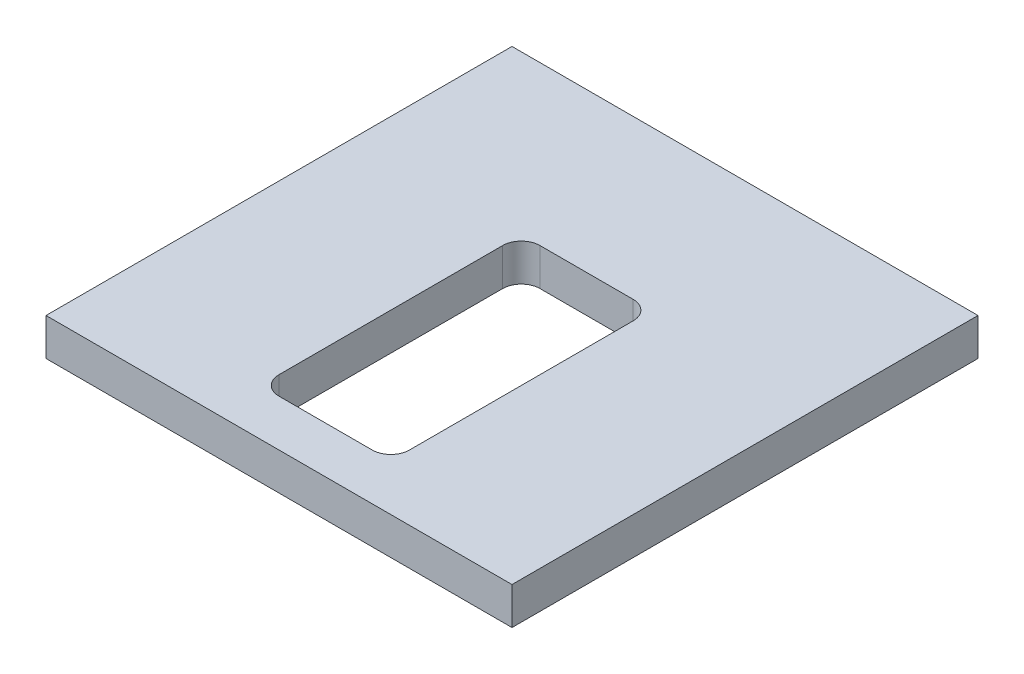
ISO-10303-21;
HEADER;
FILE_DESCRIPTION(('STEP AP214'),'2;1');
FILE_NAME('part.step','',(''),(''),'','','');
FILE_SCHEMA(('AUTOMOTIVE_DESIGN { 1 0 10303 214 1 1 1 1 }'));
ENDSEC;
DATA;
#1=APPLICATION_CONTEXT('core data for automotive mechanical design processes');
#2=APPLICATION_PROTOCOL_DEFINITION('international standard','automotive_design',2000,#1);
#3=PRODUCT_CONTEXT('',#1,'mechanical');
#4=PRODUCT('Part','Part','',(#3));
#5=PRODUCT_RELATED_PRODUCT_CATEGORY('part','',(#4));
#6=PRODUCT_DEFINITION_FORMATION('','',#4);
#7=PRODUCT_DEFINITION_CONTEXT('part definition',#1,'design');
#8=PRODUCT_DEFINITION('design','',#6,#7);
#9=PRODUCT_DEFINITION_SHAPE('','',#8);
#10=(LENGTH_UNIT() NAMED_UNIT(*) SI_UNIT(.MILLI.,.METRE.));
#11=(NAMED_UNIT(*) PLANE_ANGLE_UNIT() SI_UNIT($,.RADIAN.));
#12=(NAMED_UNIT(*) SI_UNIT($,.STERADIAN.) SOLID_ANGLE_UNIT());
#13=UNCERTAINTY_MEASURE_WITH_UNIT(LENGTH_MEASURE(1.E-05),#10,'distance_accuracy_value','');
#14=(GEOMETRIC_REPRESENTATION_CONTEXT(3) GLOBAL_UNCERTAINTY_ASSIGNED_CONTEXT((#13)) GLOBAL_UNIT_ASSIGNED_CONTEXT((#10,
#11,#12)) REPRESENTATION_CONTEXT('',''));
#15=CARTESIAN_POINT('',(0.,0.,0.));
#16=DIRECTION('',(0.,0.,1.));
#17=DIRECTION('',(1.,0.,0.));
#18=AXIS2_PLACEMENT_3D('',#15,#16,#17);
#19=CARTESIAN_POINT('',(12.5,1.,12.5));
#20=DIRECTION('',(-1.,0.,0.));
#21=DIRECTION('',(0.,0.,1.));
#22=AXIS2_PLACEMENT_3D('',#19,#20,#21);
#23=PLANE('',#22);
#24=DIRECTION('',(0.,0.,-1.));
#25=VECTOR('',#24,1.);
#26=CARTESIAN_POINT('',(12.5,-1.,12.5));
#27=LINE('',#26,#25);
#28=CARTESIAN_POINT('',(12.5,-1.,12.5));
#29=VERTEX_POINT('',#28);
#30=CARTESIAN_POINT('',(12.5,-1.,-12.5));
#31=VERTEX_POINT('',#30);
#32=EDGE_CURVE('E145',#29,#31,#27,.T.);
#33=ORIENTED_EDGE('',*,*,#32,.T.);
#34=DIRECTION('',(0.,-1.,0.));
#35=VECTOR('',#34,1.);
#36=CARTESIAN_POINT('',(12.5,1.,-12.5));
#37=LINE('',#36,#35);
#38=CARTESIAN_POINT('',(12.5,1.,-12.5));
#39=VERTEX_POINT('',#38);
#40=EDGE_CURVE('E126',#39,#31,#37,.T.);
#41=ORIENTED_EDGE('',*,*,#40,.F.);
#42=DIRECTION('',(0.,0.,-1.));
#43=VECTOR('',#42,1.);
#44=CARTESIAN_POINT('',(12.5,1.,12.5));
#45=LINE('',#44,#43);
#46=CARTESIAN_POINT('',(12.5,1.,12.5));
#47=VERTEX_POINT('',#46);
#48=EDGE_CURVE('E133',#47,#39,#45,.T.);
#49=ORIENTED_EDGE('',*,*,#48,.F.);
#50=DIRECTION('',(0.,-1.,0.));
#51=VECTOR('',#50,1.);
#52=CARTESIAN_POINT('',(12.5,1.,12.5));
#53=LINE('',#52,#51);
#54=EDGE_CURVE('E220',#47,#29,#53,.T.);
#55=ORIENTED_EDGE('',*,*,#54,.T.);
#56=EDGE_LOOP('',(#33,#41,#49,#55));
#57=FACE_BOUND('',#56,.T.);
#58=ADVANCED_FACE('F32',(#57),#23,.F.);
#59=CARTESIAN_POINT('',(-12.5,1.,-12.5));
#60=DIRECTION('',(0.,0.,1.));
#61=DIRECTION('',(1.,0.,0.));
#62=AXIS2_PLACEMENT_3D('',#59,#60,#61);
#63=PLANE('',#62);
#64=DIRECTION('',(-1.,0.,0.));
#65=VECTOR('',#64,1.);
#66=CARTESIAN_POINT('',(-12.5,-1.,-12.5));
#67=LINE('',#66,#65);
#68=CARTESIAN_POINT('',(-12.5,-1.,-12.5));
#69=VERTEX_POINT('',#68);
#70=EDGE_CURVE('E222',#31,#69,#67,.T.);
#71=ORIENTED_EDGE('',*,*,#70,.T.);
#72=DIRECTION('',(0.,-1.,0.));
#73=VECTOR('',#72,1.);
#74=CARTESIAN_POINT('',(-12.5,1.,-12.5));
#75=LINE('',#74,#73);
#76=CARTESIAN_POINT('',(-12.5,1.,-12.5));
#77=VERTEX_POINT('',#76);
#78=EDGE_CURVE('E129',#77,#69,#75,.T.);
#79=ORIENTED_EDGE('',*,*,#78,.F.);
#80=DIRECTION('',(-1.,0.,0.));
#81=VECTOR('',#80,1.);
#82=CARTESIAN_POINT('',(-12.5,1.,-12.5));
#83=LINE('',#82,#81);
#84=EDGE_CURVE('E122',#39,#77,#83,.T.);
#85=ORIENTED_EDGE('',*,*,#84,.F.);
#86=ORIENTED_EDGE('',*,*,#40,.T.);
#87=EDGE_LOOP('',(#71,#79,#85,#86));
#88=FACE_BOUND('',#87,.T.);
#89=ADVANCED_FACE('F124',(#88),#63,.F.);
#90=CARTESIAN_POINT('',(-12.5,1.,12.5));
#91=DIRECTION('',(1.,0.,0.));
#92=DIRECTION('',(0.,0.,-1.));
#93=AXIS2_PLACEMENT_3D('',#90,#91,#92);
#94=PLANE('',#93);
#95=DIRECTION('',(0.,0.,1.));
#96=VECTOR('',#95,1.);
#97=CARTESIAN_POINT('',(-12.5,-1.,12.5));
#98=LINE('',#97,#96);
#99=CARTESIAN_POINT('',(-12.5,-1.,12.5));
#100=VERTEX_POINT('',#99);
#101=EDGE_CURVE('E224',#69,#100,#98,.T.);
#102=ORIENTED_EDGE('',*,*,#101,.T.);
#103=DIRECTION('',(0.,-1.,0.));
#104=VECTOR('',#103,1.);
#105=CARTESIAN_POINT('',(-12.5,1.,12.5));
#106=LINE('',#105,#104);
#107=CARTESIAN_POINT('',(-12.5,1.,12.5));
#108=VERTEX_POINT('',#107);
#109=EDGE_CURVE('E150',#108,#100,#106,.T.);
#110=ORIENTED_EDGE('',*,*,#109,.F.);
#111=DIRECTION('',(0.,0.,1.));
#112=VECTOR('',#111,1.);
#113=CARTESIAN_POINT('',(-12.5,1.,12.5));
#114=LINE('',#113,#112);
#115=EDGE_CURVE('E132',#77,#108,#114,.T.);
#116=ORIENTED_EDGE('',*,*,#115,.F.);
#117=ORIENTED_EDGE('',*,*,#78,.T.);
#118=EDGE_LOOP('',(#102,#110,#116,#117));
#119=FACE_BOUND('',#118,.T.);
#120=ADVANCED_FACE('F234',(#119),#94,.F.);
#121=CARTESIAN_POINT('',(-12.5,1.,12.5));
#122=DIRECTION('',(0.,0.,-1.));
#123=DIRECTION('',(-1.,0.,0.));
#124=AXIS2_PLACEMENT_3D('',#121,#122,#123);
#125=PLANE('',#124);
#126=DIRECTION('',(1.,0.,0.));
#127=VECTOR('',#126,1.);
#128=CARTESIAN_POINT('',(-12.5,-1.,12.5));
#129=LINE('',#128,#127);
#130=EDGE_CURVE('E142',#100,#29,#129,.T.);
#131=ORIENTED_EDGE('',*,*,#130,.T.);
#132=ORIENTED_EDGE('',*,*,#54,.F.);
#133=DIRECTION('',(1.,0.,0.));
#134=VECTOR('',#133,1.);
#135=CARTESIAN_POINT('',(-12.5,1.,12.5));
#136=LINE('',#135,#134);
#137=EDGE_CURVE('E138',#108,#47,#136,.T.);
#138=ORIENTED_EDGE('',*,*,#137,.F.);
#139=ORIENTED_EDGE('',*,*,#109,.T.);
#140=EDGE_LOOP('',(#131,#132,#138,#139));
#141=FACE_BOUND('',#140,.T.);
#142=ADVANCED_FACE('F231',(#141),#125,.F.);
#143=CARTESIAN_POINT('',(0.,1.,0.));
#144=DIRECTION('',(0.,-1.,0.));
#145=DIRECTION('',(0.,0.,-1.));
#146=AXIS2_PLACEMENT_3D('',#143,#144,#145);
#147=PLANE('',#146);
#148=DIRECTION('',(1.,0.,0.));
#149=VECTOR('',#148,1.);
#150=CARTESIAN_POINT('',(-3.5,1.,10.));
#151=LINE('',#150,#149);
#152=CARTESIAN_POINT('',(-2.5,1.,10.));
#153=VERTEX_POINT('',#152);
#154=CARTESIAN_POINT('',(2.5,1.,10.));
#155=VERTEX_POINT('',#154);
#156=EDGE_CURVE('E206',#153,#155,#151,.T.);
#157=ORIENTED_EDGE('',*,*,#156,.F.);
#158=CARTESIAN_POINT('',(-2.5,1.,9.));
#159=DIRECTION('',(0.,-1.,0.));
#160=DIRECTION('',(0.,0.,-1.));
#161=AXIS2_PLACEMENT_3D('',#158,#159,#160);
#162=CIRCLE('',#161,1.);
#163=CARTESIAN_POINT('',(-3.5,1.,9.));
#164=VERTEX_POINT('',#163);
#165=EDGE_CURVE('E174',#153,#164,#162,.T.);
#166=ORIENTED_EDGE('',*,*,#165,.T.);
#167=DIRECTION('',(0.,0.,1.));
#168=VECTOR('',#167,1.);
#169=CARTESIAN_POINT('',(-3.5,1.,-4.));
#170=LINE('',#169,#168);
#171=CARTESIAN_POINT('',(-3.5,1.,-3.));
#172=VERTEX_POINT('',#171);
#173=EDGE_CURVE('E186',#172,#164,#170,.T.);
#174=ORIENTED_EDGE('',*,*,#173,.F.);
#175=CARTESIAN_POINT('',(-2.5,1.,-3.));
#176=DIRECTION('',(0.,-1.,0.));
#177=DIRECTION('',(0.,0.,-1.));
#178=AXIS2_PLACEMENT_3D('',#175,#176,#177);
#179=CIRCLE('',#178,1.);
#180=CARTESIAN_POINT('',(-2.5,1.,-4.));
#181=VERTEX_POINT('',#180);
#182=EDGE_CURVE('E40',#172,#181,#179,.T.);
#183=ORIENTED_EDGE('',*,*,#182,.T.);
#184=DIRECTION('',(-1.,0.,0.));
#185=VECTOR('',#184,1.);
#186=CARTESIAN_POINT('',(-3.5,1.,-4.));
#187=LINE('',#186,#185);
#188=CARTESIAN_POINT('',(2.5,1.,-4.));
#189=VERTEX_POINT('',#188);
#190=EDGE_CURVE('E184',#189,#181,#187,.T.);
#191=ORIENTED_EDGE('',*,*,#190,.F.);
#192=CARTESIAN_POINT('',(2.5,1.,-3.));
#193=DIRECTION('',(0.,-1.,0.));
#194=DIRECTION('',(0.,0.,-1.));
#195=AXIS2_PLACEMENT_3D('',#192,#193,#194);
#196=CIRCLE('',#195,1.);
#197=CARTESIAN_POINT('',(3.5,1.,-3.));
#198=VERTEX_POINT('',#197);
#199=EDGE_CURVE('E178',#189,#198,#196,.T.);
#200=ORIENTED_EDGE('',*,*,#199,.T.);
#201=DIRECTION('',(0.,0.,-1.));
#202=VECTOR('',#201,1.);
#203=CARTESIAN_POINT('',(3.5,1.,-4.));
#204=LINE('',#203,#202);
#205=CARTESIAN_POINT('',(3.5,1.,9.));
#206=VERTEX_POINT('',#205);
#207=EDGE_CURVE('E192',#206,#198,#204,.T.);
#208=ORIENTED_EDGE('',*,*,#207,.F.);
#209=CARTESIAN_POINT('',(2.5,1.,9.));
#210=DIRECTION('',(0.,-1.,0.));
#211=DIRECTION('',(0.,0.,-1.));
#212=AXIS2_PLACEMENT_3D('',#209,#210,#211);
#213=CIRCLE('',#212,1.);
#214=EDGE_CURVE('E170',#206,#155,#213,.T.);
#215=ORIENTED_EDGE('',*,*,#214,.T.);
#216=EDGE_LOOP('',(#157,#166,#174,#183,#191,#200,#208,#215));
#217=FACE_BOUND('',#216,.T.);
#218=ORIENTED_EDGE('',*,*,#48,.T.);
#219=ORIENTED_EDGE('',*,*,#84,.T.);
#220=ORIENTED_EDGE('',*,*,#115,.T.);
#221=ORIENTED_EDGE('',*,*,#137,.T.);
#222=EDGE_LOOP('',(#218,#219,#220,#221));
#223=FACE_BOUND('',#222,.T.);
#224=ADVANCED_FACE('F136',(#217,#223),#147,.F.);
#225=CARTESIAN_POINT('',(0.,-1.,0.));
#226=DIRECTION('',(0.,-1.,0.));
#227=DIRECTION('',(0.,0.,-1.));
#228=AXIS2_PLACEMENT_3D('',#225,#226,#227);
#229=PLANE('',#228);
#230=DIRECTION('',(-1.,0.,0.));
#231=VECTOR('',#230,1.);
#232=CARTESIAN_POINT('',(-3.5,-1.,-4.));
#233=LINE('',#232,#231);
#234=CARTESIAN_POINT('',(2.5,-1.,-4.));
#235=VERTEX_POINT('',#234);
#236=CARTESIAN_POINT('',(-2.5,-1.,-4.));
#237=VERTEX_POINT('',#236);
#238=EDGE_CURVE('E201',#235,#237,#233,.T.);
#239=ORIENTED_EDGE('',*,*,#238,.T.);
#240=CARTESIAN_POINT('',(-2.5,-1.,-3.));
#241=DIRECTION('',(0.,-1.,0.));
#242=DIRECTION('',(0.,0.,-1.));
#243=AXIS2_PLACEMENT_3D('',#240,#241,#242);
#244=CIRCLE('',#243,1.);
#245=CARTESIAN_POINT('',(-3.5,-1.,-3.));
#246=VERTEX_POINT('',#245);
#247=EDGE_CURVE('E11',#237,#246,#244,.F.);
#248=ORIENTED_EDGE('',*,*,#247,.T.);
#249=DIRECTION('',(0.,0.,1.));
#250=VECTOR('',#249,1.);
#251=CARTESIAN_POINT('',(-3.5,-1.,-4.));
#252=LINE('',#251,#250);
#253=CARTESIAN_POINT('',(-3.5,-1.,9.));
#254=VERTEX_POINT('',#253);
#255=EDGE_CURVE('E199',#246,#254,#252,.T.);
#256=ORIENTED_EDGE('',*,*,#255,.T.);
#257=CARTESIAN_POINT('',(-2.5,-1.,9.));
#258=DIRECTION('',(0.,-1.,0.));
#259=DIRECTION('',(0.,0.,-1.));
#260=AXIS2_PLACEMENT_3D('',#257,#258,#259);
#261=CIRCLE('',#260,1.);
#262=CARTESIAN_POINT('',(-2.5,-1.,10.));
#263=VERTEX_POINT('',#262);
#264=EDGE_CURVE('E176',#254,#263,#261,.F.);
#265=ORIENTED_EDGE('',*,*,#264,.T.);
#266=DIRECTION('',(1.,0.,0.));
#267=VECTOR('',#266,1.);
#268=CARTESIAN_POINT('',(-3.5,-1.,10.));
#269=LINE('',#268,#267);
#270=CARTESIAN_POINT('',(2.5,-1.,10.));
#271=VERTEX_POINT('',#270);
#272=EDGE_CURVE('E191',#263,#271,#269,.T.);
#273=ORIENTED_EDGE('',*,*,#272,.T.);
#274=CARTESIAN_POINT('',(2.5,-1.,9.));
#275=DIRECTION('',(0.,-1.,0.));
#276=DIRECTION('',(0.,0.,-1.));
#277=AXIS2_PLACEMENT_3D('',#274,#275,#276);
#278=CIRCLE('',#277,1.);
#279=CARTESIAN_POINT('',(3.5,-1.,9.));
#280=VERTEX_POINT('',#279);
#281=EDGE_CURVE('E172',#271,#280,#278,.F.);
#282=ORIENTED_EDGE('',*,*,#281,.T.);
#283=DIRECTION('',(0.,0.,-1.));
#284=VECTOR('',#283,1.);
#285=CARTESIAN_POINT('',(3.5,-1.,-4.));
#286=LINE('',#285,#284);
#287=CARTESIAN_POINT('',(3.5,-1.,-3.));
#288=VERTEX_POINT('',#287);
#289=EDGE_CURVE('E208',#280,#288,#286,.T.);
#290=ORIENTED_EDGE('',*,*,#289,.T.);
#291=CARTESIAN_POINT('',(2.5,-1.,-3.));
#292=DIRECTION('',(0.,-1.,0.));
#293=DIRECTION('',(0.,0.,-1.));
#294=AXIS2_PLACEMENT_3D('',#291,#292,#293);
#295=CIRCLE('',#294,1.);
#296=EDGE_CURVE('E54',#288,#235,#295,.F.);
#297=ORIENTED_EDGE('',*,*,#296,.T.);
#298=EDGE_LOOP('',(#239,#248,#256,#265,#273,#282,#290,#297));
#299=FACE_BOUND('',#298,.T.);
#300=ORIENTED_EDGE('',*,*,#32,.F.);
#301=ORIENTED_EDGE('',*,*,#130,.F.);
#302=ORIENTED_EDGE('',*,*,#101,.F.);
#303=ORIENTED_EDGE('',*,*,#70,.F.);
#304=EDGE_LOOP('',(#300,#301,#302,#303));
#305=FACE_BOUND('',#304,.T.);
#306=ADVANCED_FACE('F197',(#299,#305),#229,.T.);
#307=CARTESIAN_POINT('',(-3.5,-1.001,-4.));
#308=DIRECTION('',(-1.,0.,0.));
#309=DIRECTION('',(0.,0.,1.));
#310=AXIS2_PLACEMENT_3D('',#307,#308,#309);
#311=PLANE('',#310);
#312=ORIENTED_EDGE('',*,*,#173,.T.);
#313=DIRECTION('',(0.,1.,0.));
#314=VECTOR('',#313,1.);
#315=CARTESIAN_POINT('',(-3.5,-1.,9.));
#316=LINE('',#315,#314);
#317=EDGE_CURVE('E164',#164,#254,#316,.F.);
#318=ORIENTED_EDGE('',*,*,#317,.T.);
#319=ORIENTED_EDGE('',*,*,#255,.F.);
#320=DIRECTION('',(0.,1.,0.));
#321=VECTOR('',#320,1.);
#322=CARTESIAN_POINT('',(-3.5,1.,-3.));
#323=LINE('',#322,#321);
#324=EDGE_CURVE('E161',#246,#172,#323,.T.);
#325=ORIENTED_EDGE('',*,*,#324,.T.);
#326=EDGE_LOOP('',(#312,#318,#319,#325));
#327=FACE_BOUND('',#326,.T.);
#328=ADVANCED_FACE('F203',(#327),#311,.F.);
#329=CARTESIAN_POINT('',(-3.5,-1.001,-4.));
#330=DIRECTION('',(0.,0.,-1.));
#331=DIRECTION('',(-1.,0.,0.));
#332=AXIS2_PLACEMENT_3D('',#329,#330,#331);
#333=PLANE('',#332);
#334=ORIENTED_EDGE('',*,*,#238,.F.);
#335=DIRECTION('',(0.,1.,0.));
#336=VECTOR('',#335,1.);
#337=CARTESIAN_POINT('',(2.5,1.,-4.));
#338=LINE('',#337,#336);
#339=EDGE_CURVE('E167',#235,#189,#338,.T.);
#340=ORIENTED_EDGE('',*,*,#339,.T.);
#341=ORIENTED_EDGE('',*,*,#190,.T.);
#342=DIRECTION('',(0.,1.,0.));
#343=VECTOR('',#342,1.);
#344=CARTESIAN_POINT('',(-2.5,-1.,-4.));
#345=LINE('',#344,#343);
#346=EDGE_CURVE('E47',#181,#237,#345,.F.);
#347=ORIENTED_EDGE('',*,*,#346,.T.);
#348=EDGE_LOOP('',(#334,#340,#341,#347));
#349=FACE_BOUND('',#348,.T.);
#350=ADVANCED_FACE('F189',(#349),#333,.F.);
#351=CARTESIAN_POINT('',(3.5,-1.001,-4.));
#352=DIRECTION('',(1.,0.,0.));
#353=DIRECTION('',(0.,0.,-1.));
#354=AXIS2_PLACEMENT_3D('',#351,#352,#353);
#355=PLANE('',#354);
#356=ORIENTED_EDGE('',*,*,#289,.F.);
#357=DIRECTION('',(0.,1.,0.));
#358=VECTOR('',#357,1.);
#359=CARTESIAN_POINT('',(3.5,1.,9.));
#360=LINE('',#359,#358);
#361=EDGE_CURVE('E148',#280,#206,#360,.T.);
#362=ORIENTED_EDGE('',*,*,#361,.T.);
#363=ORIENTED_EDGE('',*,*,#207,.T.);
#364=DIRECTION('',(0.,1.,0.));
#365=VECTOR('',#364,1.);
#366=CARTESIAN_POINT('',(3.5,-1.,-3.));
#367=LINE('',#366,#365);
#368=EDGE_CURVE('E146',#198,#288,#367,.F.);
#369=ORIENTED_EDGE('',*,*,#368,.T.);
#370=EDGE_LOOP('',(#356,#362,#363,#369));
#371=FACE_BOUND('',#370,.T.);
#372=ADVANCED_FACE('F266',(#371),#355,.F.);
#373=CARTESIAN_POINT('',(-3.5,-1.001,10.));
#374=DIRECTION('',(0.,0.,1.));
#375=DIRECTION('',(1.,0.,0.));
#376=AXIS2_PLACEMENT_3D('',#373,#374,#375);
#377=PLANE('',#376);
#378=ORIENTED_EDGE('',*,*,#156,.T.);
#379=DIRECTION('',(0.,1.,0.));
#380=VECTOR('',#379,1.);
#381=CARTESIAN_POINT('',(2.5,-1.,10.));
#382=LINE('',#381,#380);
#383=EDGE_CURVE('E159',#155,#271,#382,.F.);
#384=ORIENTED_EDGE('',*,*,#383,.T.);
#385=ORIENTED_EDGE('',*,*,#272,.F.);
#386=DIRECTION('',(0.,1.,0.));
#387=VECTOR('',#386,1.);
#388=CARTESIAN_POINT('',(-2.5,1.,10.));
#389=LINE('',#388,#387);
#390=EDGE_CURVE('E156',#263,#153,#389,.T.);
#391=ORIENTED_EDGE('',*,*,#390,.T.);
#392=EDGE_LOOP('',(#378,#384,#385,#391));
#393=FACE_BOUND('',#392,.T.);
#394=ADVANCED_FACE('F252',(#393),#377,.F.);
#395=CARTESIAN_POINT('',(2.5,-1.001,9.));
#396=DIRECTION('',(0.,-1.,0.));
#397=DIRECTION('',(0.,0.,-1.));
#398=AXIS2_PLACEMENT_3D('',#395,#396,#397);
#399=CYLINDRICAL_SURFACE('',#398,1.);
#400=ORIENTED_EDGE('',*,*,#281,.F.);
#401=ORIENTED_EDGE('',*,*,#383,.F.);
#402=ORIENTED_EDGE('',*,*,#214,.F.);
#403=ORIENTED_EDGE('',*,*,#361,.F.);
#404=EDGE_LOOP('',(#400,#401,#402,#403));
#405=FACE_BOUND('',#404,.T.);
#406=ADVANCED_FACE('F248',(#405),#399,.F.);
#407=CARTESIAN_POINT('',(-2.5,-1.001,9.));
#408=DIRECTION('',(0.,-1.,0.));
#409=DIRECTION('',(0.,0.,-1.));
#410=AXIS2_PLACEMENT_3D('',#407,#408,#409);
#411=CYLINDRICAL_SURFACE('',#410,1.);
#412=ORIENTED_EDGE('',*,*,#264,.F.);
#413=ORIENTED_EDGE('',*,*,#317,.F.);
#414=ORIENTED_EDGE('',*,*,#165,.F.);
#415=ORIENTED_EDGE('',*,*,#390,.F.);
#416=EDGE_LOOP('',(#412,#413,#414,#415));
#417=FACE_BOUND('',#416,.T.);
#418=ADVANCED_FACE('F251',(#417),#411,.F.);
#419=CARTESIAN_POINT('',(2.5,-1.001,-3.));
#420=DIRECTION('',(0.,-1.,0.));
#421=DIRECTION('',(0.,0.,-1.));
#422=AXIS2_PLACEMENT_3D('',#419,#420,#421);
#423=CYLINDRICAL_SURFACE('',#422,1.);
#424=ORIENTED_EDGE('',*,*,#296,.F.);
#425=ORIENTED_EDGE('',*,*,#368,.F.);
#426=ORIENTED_EDGE('',*,*,#199,.F.);
#427=ORIENTED_EDGE('',*,*,#339,.F.);
#428=EDGE_LOOP('',(#424,#425,#426,#427));
#429=FACE_BOUND('',#428,.T.);
#430=ADVANCED_FACE('F255',(#429),#423,.F.);
#431=CARTESIAN_POINT('',(-2.5,-1.001,-3.));
#432=DIRECTION('',(0.,-1.,0.));
#433=DIRECTION('',(0.,0.,-1.));
#434=AXIS2_PLACEMENT_3D('',#431,#432,#433);
#435=CYLINDRICAL_SURFACE('',#434,1.);
#436=ORIENTED_EDGE('',*,*,#247,.F.);
#437=ORIENTED_EDGE('',*,*,#346,.F.);
#438=ORIENTED_EDGE('',*,*,#182,.F.);
#439=ORIENTED_EDGE('',*,*,#324,.F.);
#440=EDGE_LOOP('',(#436,#437,#438,#439));
#441=FACE_BOUND('',#440,.T.);
#442=ADVANCED_FACE('F34',(#441),#435,.F.);
#443=CLOSED_SHELL('',(#58,#89,#120,#142,#224,#306,#328,#350,#372,#394,#406,#418,#430,#442));
#444=MANIFOLD_SOLID_BREP('B2',#443);
#445=ADVANCED_BREP_SHAPE_REPRESENTATION('',(#18,#444),#14);
#446=SHAPE_DEFINITION_REPRESENTATION(#9,#445);
ENDSEC;
END-ISO-10303-21;
